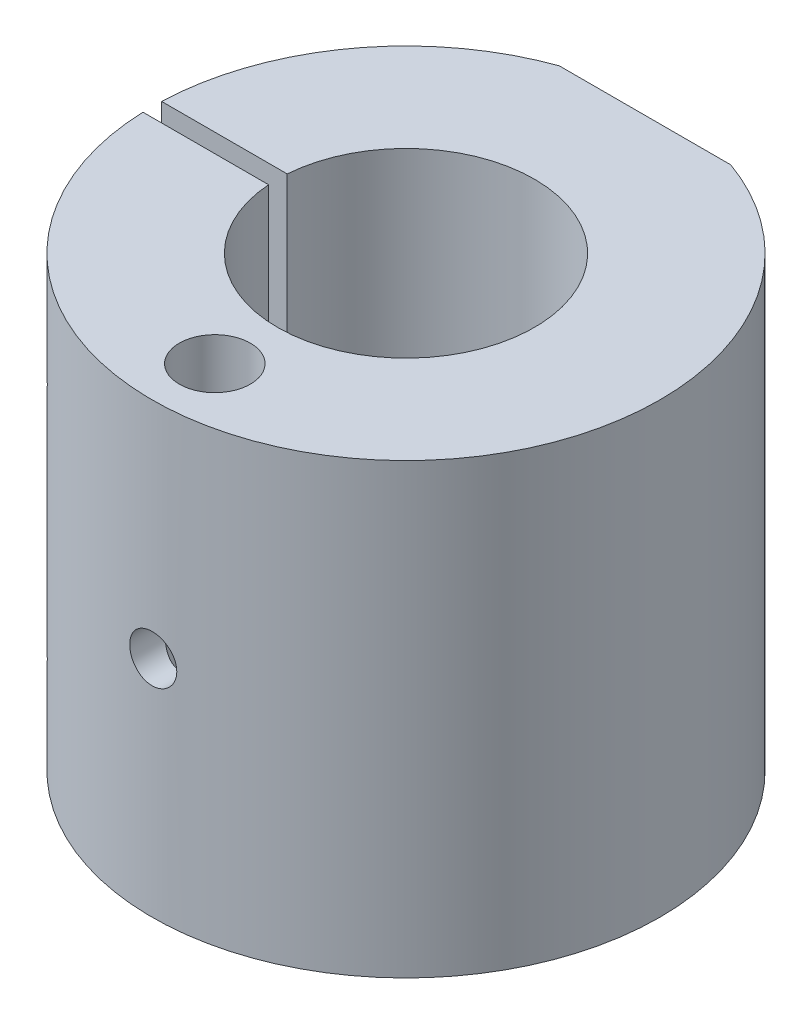
ISO-10303-21;
HEADER;
FILE_DESCRIPTION(('STEP AP214'),'2;1');
FILE_NAME('part.step','',(''),(''),'','','');
FILE_SCHEMA(('AUTOMOTIVE_DESIGN { 1 0 10303 214 1 1 1 1 }'));
ENDSEC;
DATA;
#1=APPLICATION_CONTEXT('core data for automotive mechanical design processes');
#2=APPLICATION_PROTOCOL_DEFINITION('international standard','automotive_design',2000,#1);
#3=PRODUCT_CONTEXT('',#1,'mechanical');
#4=PRODUCT('Part','Part','',(#3));
#5=PRODUCT_RELATED_PRODUCT_CATEGORY('part','',(#4));
#6=PRODUCT_DEFINITION_FORMATION('','',#4);
#7=PRODUCT_DEFINITION_CONTEXT('part definition',#1,'design');
#8=PRODUCT_DEFINITION('design','',#6,#7);
#9=PRODUCT_DEFINITION_SHAPE('','',#8);
#10=(LENGTH_UNIT() NAMED_UNIT(*) SI_UNIT(.MILLI.,.METRE.));
#11=(NAMED_UNIT(*) PLANE_ANGLE_UNIT() SI_UNIT($,.RADIAN.));
#12=(NAMED_UNIT(*) SI_UNIT($,.STERADIAN.) SOLID_ANGLE_UNIT());
#13=UNCERTAINTY_MEASURE_WITH_UNIT(LENGTH_MEASURE(1.E-05),#10,'distance_accuracy_value','');
#14=(GEOMETRIC_REPRESENTATION_CONTEXT(3) GLOBAL_UNCERTAINTY_ASSIGNED_CONTEXT((#13)) GLOBAL_UNIT_ASSIGNED_CONTEXT((#10,
#11,#12)) REPRESENTATION_CONTEXT('',''));
#15=CARTESIAN_POINT('',(0.,0.,0.));
#16=DIRECTION('',(0.,0.,1.));
#17=DIRECTION('',(1.,0.,0.));
#18=AXIS2_PLACEMENT_3D('',#15,#16,#17);
#19=CARTESIAN_POINT('',(0.,38.1,0.));
#20=DIRECTION('',(0.,-1.,0.));
#21=DIRECTION('',(0.,0.,-1.));
#22=AXIS2_PLACEMENT_3D('',#19,#20,#21);
#23=CYLINDRICAL_SURFACE('',#22,21.59);
#24=CARTESIAN_POINT('',(0.,38.1,0.));
#25=DIRECTION('',(0.,1.,0.));
#26=DIRECTION('',(0.,0.,1.));
#27=AXIS2_PLACEMENT_3D('',#24,#25,#26);
#28=CIRCLE('',#27,21.59);
#29=CARTESIAN_POINT('',(-7.29559456110329,38.1,-20.32));
#30=VERTEX_POINT('',#29);
#31=CARTESIAN_POINT('',(-21.5754040735626,38.1,-0.793749999999997));
#32=VERTEX_POINT('',#31);
#33=EDGE_CURVE('E56',#30,#32,#28,.T.);
#34=ORIENTED_EDGE('',*,*,#33,.F.);
#35=DIRECTION('',(0.,1.,0.));
#36=VECTOR('',#35,1.);
#37=CARTESIAN_POINT('',(-7.29559456110329,-0.001000000000001,-20.32));
#38=LINE('',#37,#36);
#39=CARTESIAN_POINT('',(-7.29559456110329,0.,-20.32));
#40=VERTEX_POINT('',#39);
#41=EDGE_CURVE('E115',#40,#30,#38,.T.);
#42=ORIENTED_EDGE('',*,*,#41,.F.);
#43=CARTESIAN_POINT('',(0.,0.,0.));
#44=DIRECTION('',(0.,1.,0.));
#45=DIRECTION('',(0.,0.,1.));
#46=AXIS2_PLACEMENT_3D('',#43,#44,#45);
#47=CIRCLE('',#46,21.59);
#48=CARTESIAN_POINT('',(-21.5754040735626,0.,-0.793749999999997));
#49=VERTEX_POINT('',#48);
#50=EDGE_CURVE('E154',#40,#49,#47,.T.);
#51=ORIENTED_EDGE('',*,*,#50,.T.);
#52=DIRECTION('',(0.,-1.,0.));
#53=VECTOR('',#52,1.);
#54=CARTESIAN_POINT('',(-21.5754040735626,38.1,-0.793749999999997));
#55=LINE('',#54,#53);
#56=EDGE_CURVE('E138',#32,#49,#55,.T.);
#57=ORIENTED_EDGE('',*,*,#56,.F.);
#58=EDGE_LOOP('',(#34,#42,#51,#57));
#59=FACE_BOUND('',#58,.T.);
#60=ADVANCED_FACE('F47',(#59),#23,.T.);
#61=CARTESIAN_POINT('',(0.,38.1,0.));
#62=DIRECTION('',(0.,1.,0.));
#63=DIRECTION('',(0.,0.,1.));
#64=AXIS2_PLACEMENT_3D('',#61,#62,#63);
#65=PLANE('',#64);
#66=DIRECTION('',(1.,0.,0.));
#67=VECTOR('',#66,1.);
#68=CARTESIAN_POINT('',(7.29559456110329,38.1,-20.32));
#69=LINE('',#68,#67);
#70=CARTESIAN_POINT('',(7.29559456110329,38.1,-20.32));
#71=VERTEX_POINT('',#70);
#72=EDGE_CURVE('E63',#30,#71,#69,.T.);
#73=ORIENTED_EDGE('',*,*,#72,.F.);
#74=ORIENTED_EDGE('',*,*,#33,.T.);
#75=DIRECTION('',(-1.,0.,0.));
#76=VECTOR('',#75,1.);
#77=CARTESIAN_POINT('',(0.,38.1,-0.79375));
#78=LINE('',#77,#76);
#79=CARTESIAN_POINT('',(-10.8931191555725,38.1,-0.793749999999999));
#80=VERTEX_POINT('',#79);
#81=EDGE_CURVE('E144',#80,#32,#78,.T.);
#82=ORIENTED_EDGE('',*,*,#81,.F.);
#83=CARTESIAN_POINT('',(0.,38.1,0.));
#84=DIRECTION('',(0.,1.,0.));
#85=DIRECTION('',(0.,0.,1.));
#86=AXIS2_PLACEMENT_3D('',#83,#84,#85);
#87=CIRCLE('',#86,10.922);
#88=CARTESIAN_POINT('',(-10.8931191555725,38.1,0.793750000000001));
#89=VERTEX_POINT('',#88);
#90=EDGE_CURVE('E151',#89,#80,#87,.T.);
#91=ORIENTED_EDGE('',*,*,#90,.F.);
#92=DIRECTION('',(1.,0.,0.));
#93=VECTOR('',#92,1.);
#94=CARTESIAN_POINT('',(0.,38.1,0.79375));
#95=LINE('',#94,#93);
#96=CARTESIAN_POINT('',(-21.5754040735626,38.1,0.793750000000003));
#97=VERTEX_POINT('',#96);
#98=EDGE_CURVE('E147',#97,#89,#95,.T.);
#99=ORIENTED_EDGE('',*,*,#98,.F.);
#100=EDGE_CURVE('E13',#97,#71,#28,.T.);
#101=ORIENTED_EDGE('',*,*,#100,.T.);
#102=EDGE_LOOP('',(#73,#74,#82,#91,#99,#101));
#103=FACE_BOUND('',#102,.T.);
#104=CARTESIAN_POINT('',(0.,38.1,16.256));
#105=DIRECTION('',(0.,1.,0.));
#106=DIRECTION('',(0.,0.,1.));
#107=AXIS2_PLACEMENT_3D('',#104,#105,#106);
#108=CIRCLE('',#107,3.0226);
#109=CARTESIAN_POINT('',(0.,38.1,19.2786));
#110=VERTEX_POINT('',#109);
#111=EDGE_CURVE('E127',#110,#110,#108,.T.);
#112=ORIENTED_EDGE('',*,*,#111,.F.);
#113=EDGE_LOOP('',(#112));
#114=FACE_BOUND('',#113,.T.);
#115=ADVANCED_FACE('F169',(#103,#114),#65,.T.);
#116=CARTESIAN_POINT('',(0.,0.,0.));
#117=DIRECTION('',(0.,1.,0.));
#118=DIRECTION('',(0.,0.,1.));
#119=AXIS2_PLACEMENT_3D('',#116,#117,#118);
#120=PLANE('',#119);
#121=CARTESIAN_POINT('',(0.,0.,16.256));
#122=DIRECTION('',(0.,1.,0.));
#123=DIRECTION('',(0.,0.,1.));
#124=AXIS2_PLACEMENT_3D('',#121,#122,#123);
#125=CIRCLE('',#124,3.0226);
#126=CARTESIAN_POINT('',(0.,0.,19.2786));
#127=VERTEX_POINT('',#126);
#128=EDGE_CURVE('E130',#127,#127,#125,.F.);
#129=ORIENTED_EDGE('',*,*,#128,.F.);
#130=EDGE_LOOP('',(#129));
#131=FACE_BOUND('',#130,.T.);
#132=ORIENTED_EDGE('',*,*,#50,.F.);
#133=DIRECTION('',(-1.,0.,0.));
#134=VECTOR('',#133,1.);
#135=CARTESIAN_POINT('',(7.29559456110329,0.,-20.32));
#136=LINE('',#135,#134);
#137=CARTESIAN_POINT('',(7.29559456110329,0.,-20.32));
#138=VERTEX_POINT('',#137);
#139=EDGE_CURVE('E124',#138,#40,#136,.T.);
#140=ORIENTED_EDGE('',*,*,#139,.F.);
#141=CARTESIAN_POINT('',(-21.5754040735626,0.,0.793750000000003));
#142=VERTEX_POINT('',#141);
#143=EDGE_CURVE('E51',#142,#138,#47,.T.);
#144=ORIENTED_EDGE('',*,*,#143,.F.);
#145=DIRECTION('',(-1.,0.,0.));
#146=VECTOR('',#145,1.);
#147=CARTESIAN_POINT('',(0.,0.,0.79375));
#148=LINE('',#147,#146);
#149=CARTESIAN_POINT('',(-10.8931191555725,0.,0.793750000000001));
#150=VERTEX_POINT('',#149);
#151=EDGE_CURVE('E142',#150,#142,#148,.T.);
#152=ORIENTED_EDGE('',*,*,#151,.F.);
#153=CARTESIAN_POINT('',(0.,0.,0.));
#154=DIRECTION('',(0.,1.,0.));
#155=DIRECTION('',(0.,0.,1.));
#156=AXIS2_PLACEMENT_3D('',#153,#154,#155);
#157=CIRCLE('',#156,10.922);
#158=CARTESIAN_POINT('',(-10.8931191555725,0.,-0.793749999999999));
#159=VERTEX_POINT('',#158);
#160=EDGE_CURVE('E150',#150,#159,#157,.T.);
#161=ORIENTED_EDGE('',*,*,#160,.T.);
#162=DIRECTION('',(1.,0.,0.));
#163=VECTOR('',#162,1.);
#164=CARTESIAN_POINT('',(0.,0.,-0.79375));
#165=LINE('',#164,#163);
#166=EDGE_CURVE('E71',#49,#159,#165,.T.);
#167=ORIENTED_EDGE('',*,*,#166,.F.);
#168=EDGE_LOOP('',(#132,#140,#144,#152,#161,#167));
#169=FACE_BOUND('',#168,.T.);
#170=ADVANCED_FACE('F160',(#131,#169),#120,.F.);
#171=CARTESIAN_POINT('',(-17.8842616145675,29.1092355947267,12.0946800909204));
#172=CARTESIAN_POINT('',(-17.8842585584311,29.1645112923969,12.0946849197344));
#173=CARTESIAN_POINT('',(-17.8814572272963,29.2198141170862,12.0988300645471));
#174=CARTESIAN_POINT('',(-17.8705178537524,29.3287236810063,12.114981650848));
#175=CARTESIAN_POINT('',(-17.8623733870349,29.3823282969634,12.1269975557019));
#176=CARTESIAN_POINT('',(-17.8390428583441,29.4983717990455,12.1612978423738));
#177=CARTESIAN_POINT('',(-17.8226798560821,29.5600623082845,12.1852913730921));
#178=CARTESIAN_POINT('',(-17.7844092639658,29.6779206339718,12.2410797122205));
#179=CARTESIAN_POINT('',(-17.7624916573325,29.7340782159082,12.272888611114));
#180=CARTESIAN_POINT('',(-17.7021786253477,29.8678650941383,12.3598131360766));
#181=CARTESIAN_POINT('',(-17.6610722740068,29.941887306217,12.4185541520384));
#182=CARTESIAN_POINT('',(-17.5722168533333,30.0782690994564,12.5439725121161));
#183=CARTESIAN_POINT('',(-17.5244513932063,30.140598984916,12.6106693784964));
#184=CARTESIAN_POINT('',(-17.4330611129427,30.2446953739167,12.7366173584903));
#185=CARTESIAN_POINT('',(-17.390220675252,30.2881462643902,12.7950704346375));
#186=CARTESIAN_POINT('',(-17.3018580064292,30.3687262773738,12.9143067796996));
#187=CARTESIAN_POINT('',(-17.2563341085997,30.4058514140689,12.9750914884301));
#188=CARTESIAN_POINT('',(-17.1630301734843,30.4742394300064,13.0982620054874));
#189=CARTESIAN_POINT('',(-17.1152487084977,30.5054985356958,13.1606488152965));
#190=CARTESIAN_POINT('',(-17.0177614025057,30.5624433797972,13.2864686226405));
#191=CARTESIAN_POINT('',(-16.9680547882346,30.5881268507293,13.3499020345623));
#192=CARTESIAN_POINT('',(-16.8107302256385,30.6597102193637,13.548316600322));
#193=CARTESIAN_POINT('',(-16.7001759514523,30.696334382109,13.6844250475389));
#194=CARTESIAN_POINT('',(-16.4736455196231,30.7458853081251,13.9563052067048));
#195=CARTESIAN_POINT('',(-16.3576704918395,30.7588169872829,14.0920769826691));
#196=CARTESIAN_POINT('',(-16.1227397021436,30.7596328204156,14.3602577938445));
#197=CARTESIAN_POINT('',(-16.0037976672796,30.7476166288553,14.4926780776448));
#198=CARTESIAN_POINT('',(-15.7653949829693,30.6959029004973,14.7516512659179));
#199=CARTESIAN_POINT('',(-15.6459351458561,30.656239241519,14.8782111492432));
#200=CARTESIAN_POINT('',(-15.44712543031,30.5621778983121,15.084040837782));
#201=CARTESIAN_POINT('',(-15.3666530646227,30.5159617818699,15.1659624368816));
#202=CARTESIAN_POINT('',(-15.2103500011545,30.4066084309901,15.3227122435066));
#203=CARTESIAN_POINT('',(-15.1345126755737,30.343496086993,15.3975506677569));
#204=CARTESIAN_POINT('',(-15.0081440129358,30.2161118135675,15.5206183746334));
#205=CARTESIAN_POINT('',(-14.9558643058362,30.1556286737283,15.5709592075219));
#206=CARTESIAN_POINT('',(-14.8585029439286,30.0238259659124,15.6638916091562));
#207=CARTESIAN_POINT('',(-14.8134122016301,29.9525203048657,15.7064929709427));
#208=CARTESIAN_POINT('',(-14.7406620301069,29.8139313265651,15.7747584769749));
#209=CARTESIAN_POINT('',(-14.7113204368668,29.7483633283255,15.8020989405364));
#210=CARTESIAN_POINT('',(-14.6608659703766,29.6114659544436,15.8489210375911));
#211=CARTESIAN_POINT('',(-14.6397487678209,29.5401396339109,15.8684068059724));
#212=CARTESIAN_POINT('',(-14.6070932631717,29.3930135812178,15.8984726656273));
#213=CARTESIAN_POINT('',(-14.5956123924403,29.3171898720288,15.9089993670831));
#214=CARTESIAN_POINT('',(-14.5833823428621,29.1639641962526,15.9202115284396));
#215=CARTESIAN_POINT('',(-14.5826288389539,29.0865628783317,15.9209009545349));
#216=CARTESIAN_POINT('',(-14.5914323644677,28.9406586228388,15.9128320278873));
#217=CARTESIAN_POINT('',(-14.599969761122,28.8720373546274,15.905007998292));
#218=CARTESIAN_POINT('',(-14.6251935422651,28.7376511212979,15.8818167866163));
#219=CARTESIAN_POINT('',(-14.6418801298901,28.6718862274257,15.8664494165019));
#220=CARTESIAN_POINT('',(-14.6829037339814,28.5431381235274,15.8284942082047));
#221=CARTESIAN_POINT('',(-14.7074156746269,28.4802603582335,15.8057410545568));
#222=CARTESIAN_POINT('',(-14.762676512127,28.3600195190934,15.7541395933262));
#223=CARTESIAN_POINT('',(-14.7934286040355,28.3026592925792,15.7252881630152));
#224=CARTESIAN_POINT('',(-14.8748081860302,28.1696146279086,15.6484033976926));
#225=CARTESIAN_POINT('',(-14.9281716891288,28.097216542698,15.5975637779813));
#226=CARTESIAN_POINT('',(-15.0420090865757,27.9652664469093,15.4878132414272));
#227=CARTESIAN_POINT('',(-15.1024977071319,27.9057417891195,15.4288855651509));
#228=CARTESIAN_POINT('',(-15.2516104423623,27.7789162389359,15.2817243823099));
#229=CARTESIAN_POINT('',(-15.3422565097745,27.7171182456415,15.1908074738995));
#230=CARTESIAN_POINT('',(-15.5273981404125,27.6145520590779,15.0015230460747));
#231=CARTESIAN_POINT('',(-15.6218992187096,27.5738152222445,14.903144666074));
#232=CARTESIAN_POINT('',(-15.8473927615106,27.4993517899627,14.6637054599595));
#233=CARTESIAN_POINT('',(-15.9788214439848,27.473937595291,14.5204359628176));
#234=CARTESIAN_POINT('',(-16.173602389331,27.4590640519481,14.3021803774759));
#235=CARTESIAN_POINT('',(-16.2382193297395,27.4579948276925,14.2287709400857));
#236=CARTESIAN_POINT('',(-16.3663180723804,27.463280561377,14.0812368456421));
#237=CARTESIAN_POINT('',(-16.4298003088919,27.4696326144428,14.0071124796897));
#238=CARTESIAN_POINT('',(-16.5566742161214,27.4897392317191,13.8569307243798));
#239=CARTESIAN_POINT('',(-16.6200323855149,27.5036555000825,13.7808670488909));
#240=CARTESIAN_POINT('',(-16.7448493511203,27.5388841052749,13.6289316863076));
#241=CARTESIAN_POINT('',(-16.8063087582584,27.5601940356278,13.5530599448266));
#242=CARTESIAN_POINT('',(-16.9269306239158,27.6102461409653,13.4021058087891));
#243=CARTESIAN_POINT('',(-16.9860959690377,27.6389786024766,13.3270225150763));
#244=CARTESIAN_POINT('',(-17.1017915387924,27.7041388111514,13.178228384632));
#245=CARTESIAN_POINT('',(-17.1583230595029,27.7405627235517,13.1045168838132));
#246=CARTESIAN_POINT('',(-17.2792735064005,27.8297127355676,12.9447569599658));
#247=CARTESIAN_POINT('',(-17.3430128361252,27.884241820427,12.8591847416955));
#248=CARTESIAN_POINT('',(-17.4646877403234,28.0065160425828,12.6934350982814));
#249=CARTESIAN_POINT('',(-17.5226292148152,28.0742475335283,12.6132522166944));
#250=CARTESIAN_POINT('',(-17.6154360323137,28.2040661962542,12.483150122214));
#251=CARTESIAN_POINT('',(-17.6522441974051,28.2625076184724,12.431005675959));
#252=CARTESIAN_POINT('',(-17.7201138987545,28.388244490511,12.3340641361412));
#253=CARTESIAN_POINT('',(-17.7511853404747,28.4555243287413,12.2892543933953));
#254=CARTESIAN_POINT('',(-17.7974218277339,28.5782160002861,12.2221533550142));
#255=CARTESIAN_POINT('',(-17.8145820634211,28.6313542701135,12.1971076601833));
#256=CARTESIAN_POINT('',(-17.8438317185316,28.7417777321301,12.1542768301767));
#257=CARTESIAN_POINT('',(-17.855931801176,28.7990539025784,12.1364764291857));
#258=CARTESIAN_POINT('',(-17.8713010471485,28.8987125838817,12.113827840313));
#259=CARTESIAN_POINT('',(-17.8761358244356,28.9403395398661,12.1066882968306));
#260=CARTESIAN_POINT('',(-17.8826172206868,29.0243842200103,12.097112657936));
#261=CARTESIAN_POINT('',(-17.884263960682,29.0668019140886,12.0946763839686));
#262=CARTESIAN_POINT('',(-17.8842616145675,29.1092355947267,12.0946800909204));
#263=B_SPLINE_CURVE_WITH_KNOTS('',3,(#171,#172,#173,#174,#175,#176,#177,#178,#179,#180,#181,
#182,#183,#184,#185,#186,#187,#188,#189,#190,#191,#192,#193,#194,#195,#196,#197,#198,#199,#200,
#201,#202,#203,#204,#205,#206,#207,#208,#209,#210,#211,#212,#213,#214,#215,#216,#217,#218,#219,
#220,#221,#222,#223,#224,#225,#226,#227,#228,#229,#230,#231,#232,#233,#234,#235,#236,#237,#238,
#239,#240,#241,#242,#243,#244,#245,#246,#247,#248,#249,#250,#251,#252,#253,#254,#255,#256,#257,
#258,#259,#260,#261,#262),.UNSPECIFIED.,.T.,.F.,(4,2,2,2,2,2,2,2,2,2,2,2,2,2,2,2,2,2,2,2,2,2,2,
2,2,2,2,2,2,2,2,2,2,2,2,2,2,2,2,2,2,2,2,2,2,4),(0.,0.165659078587435,0.331517702981557,
0.534935807254163,0.738723384473475,1.04616357672133,1.35437432358516,1.60753195243394,
1.86084850902818,2.11432746690892,2.36790931642835,2.90345810024024,3.43889575194419,
3.97219870933683,4.50484933018719,4.87506917664172,5.24474661167796,5.5271799054836,
5.80925329828255,6.03890387535631,6.26843340083052,6.49932137187992,6.73011625084476,
6.93791990459857,7.14572873857067,7.35855306871122,7.57148664440744,7.87970602018601,
8.18857398689369,8.6136715059996,9.03940011264916,9.62426561065011,9.9174726319828,
10.2105649231623,10.510184402259,10.8097064530741,11.108838503529,11.4078217649414,
11.7665166478851,12.1248427218824,12.3837748211045,12.6422555595924,12.8252366201451,
13.0078301190627,13.1350070090302,13.2621790707475),.UNSPECIFIED.);
#264=CARTESIAN_POINT('',(-17.8842616145675,29.1092355947267,12.0946800909204));
#265=VERTEX_POINT('',#264);
#266=EDGE_CURVE('E211',#265,#265,#263,.T.);
#267=ORIENTED_EDGE('',*,*,#266,.T.);
#268=EDGE_LOOP('',(#267));
#269=FACE_BOUND('',#268,.T.);
#270=CARTESIAN_POINT('',(-17.8842616145675,8.90395449077097,12.0946800909204));
#271=CARTESIAN_POINT('',(-17.8842585584311,8.95923018844116,12.0946849197344));
#272=CARTESIAN_POINT('',(-17.8814572272963,9.01453301313049,12.0988300645471));
#273=CARTESIAN_POINT('',(-17.8705178537524,9.12344257705059,12.114981650848));
#274=CARTESIAN_POINT('',(-17.8623733870349,9.17704719300767,12.1269975557019));
#275=CARTESIAN_POINT('',(-17.8390428583441,9.29309069508979,12.1612978423738));
#276=CARTESIAN_POINT('',(-17.8226798560821,9.35478120432878,12.1852913730921));
#277=CARTESIAN_POINT('',(-17.7844092639658,9.472639530016,12.2410797122205));
#278=CARTESIAN_POINT('',(-17.7624916573325,9.52879711195247,12.272888611114));
#279=CARTESIAN_POINT('',(-17.7021786253477,9.66258399018259,12.3598131360766));
#280=CARTESIAN_POINT('',(-17.6610722740068,9.73660620226129,12.4185541520384));
#281=CARTESIAN_POINT('',(-17.5722168533332,9.87298799550064,12.5439725121161));
#282=CARTESIAN_POINT('',(-17.5244513932063,9.93531788096027,12.6106693784964));
#283=CARTESIAN_POINT('',(-17.4330611129427,10.039414269961,12.7366173584903));
#284=CARTESIAN_POINT('',(-17.390220675252,10.0828651604344,12.7950704346375));
#285=CARTESIAN_POINT('',(-17.3018580064292,10.1634451734181,12.9143067796996));
#286=CARTESIAN_POINT('',(-17.2563341085997,10.2005703101132,12.9750914884301));
#287=CARTESIAN_POINT('',(-17.1630301734843,10.2689583260507,13.0982620054874));
#288=CARTESIAN_POINT('',(-17.1152487084977,10.3002174317401,13.1606488152965));
#289=CARTESIAN_POINT('',(-17.0177614025057,10.3571622758414,13.2864686226405));
#290=CARTESIAN_POINT('',(-16.9680547882346,10.3828457467735,13.3499020345623));
#291=CARTESIAN_POINT('',(-16.8107302256385,10.4544291154079,13.548316600322));
#292=CARTESIAN_POINT('',(-16.7001759514523,10.4910532781533,13.6844250475389));
#293=CARTESIAN_POINT('',(-16.4736455196231,10.5406042041693,13.9563052067048));
#294=CARTESIAN_POINT('',(-16.3576704918395,10.5535358833271,14.0920769826691));
#295=CARTESIAN_POINT('',(-16.1227397021436,10.5543517164599,14.3602577938445));
#296=CARTESIAN_POINT('',(-16.0037976672796,10.5423355248995,14.4926780776448));
#297=CARTESIAN_POINT('',(-15.7653949829692,10.4906217965416,14.7516512659179));
#298=CARTESIAN_POINT('',(-15.6459351458561,10.4509581375632,14.8782111492432));
#299=CARTESIAN_POINT('',(-15.44712543031,10.3568967943563,15.084040837782));
#300=CARTESIAN_POINT('',(-15.3666530646227,10.3106806779142,15.1659624368816));
#301=CARTESIAN_POINT('',(-15.2103500011545,10.2013273270343,15.3227122435066));
#302=CARTESIAN_POINT('',(-15.1345126755737,10.1382149830372,15.3975506677569));
#303=CARTESIAN_POINT('',(-15.0081440129358,10.0108307096118,15.5206183746334));
#304=CARTESIAN_POINT('',(-14.9558643058362,9.95034756977252,15.5709592075219));
#305=CARTESIAN_POINT('',(-14.8585029439286,9.81854486195667,15.6638916091562));
#306=CARTESIAN_POINT('',(-14.8134122016301,9.74723920090991,15.7064929709427));
#307=CARTESIAN_POINT('',(-14.7406620301069,9.60865022260932,15.7747584769749));
#308=CARTESIAN_POINT('',(-14.7113204368668,9.54308222436972,15.8020989405364));
#309=CARTESIAN_POINT('',(-14.6608659703766,9.40618485048783,15.8489210375911));
#310=CARTESIAN_POINT('',(-14.6397487678209,9.33485852995519,15.8684068059724));
#311=CARTESIAN_POINT('',(-14.6070932631717,9.18773247726206,15.8984726656274));
#312=CARTESIAN_POINT('',(-14.5956123924403,9.11190876807305,15.9089993670831));
#313=CARTESIAN_POINT('',(-14.5833823428621,8.95868309229688,15.9202115284396));
#314=CARTESIAN_POINT('',(-14.5826288389539,8.88128177437597,15.9209009545349));
#315=CARTESIAN_POINT('',(-14.5914323644677,8.73537751888308,15.9128320278873));
#316=CARTESIAN_POINT('',(-14.599969761122,8.66675625067163,15.905007998292));
#317=CARTESIAN_POINT('',(-14.6251935422651,8.53237001734219,15.8818167866163));
#318=CARTESIAN_POINT('',(-14.6418801298901,8.46660512347,15.8664494165019));
#319=CARTESIAN_POINT('',(-14.6829037339813,8.33785701957164,15.8284942082047));
#320=CARTESIAN_POINT('',(-14.7074156746269,8.27497925427777,15.8057410545568));
#321=CARTESIAN_POINT('',(-14.762676512127,8.15473841513762,15.7541395933262));
#322=CARTESIAN_POINT('',(-14.7934286040355,8.09737818862341,15.7252881630152));
#323=CARTESIAN_POINT('',(-14.8748081860302,7.96433352395281,15.6484033976926));
#324=CARTESIAN_POINT('',(-14.9281716891288,7.8919354387422,15.5975637779813));
#325=CARTESIAN_POINT('',(-15.0420090865757,7.75998534295359,15.4878132414272));
#326=CARTESIAN_POINT('',(-15.1024977071319,7.70046068516377,15.4288855651509));
#327=CARTESIAN_POINT('',(-15.2516104423623,7.57363513498014,15.2817243823099));
#328=CARTESIAN_POINT('',(-15.3422565097745,7.51183714168572,15.1908074738995));
#329=CARTESIAN_POINT('',(-15.5273981404125,7.40927095512215,15.0015230460747));
#330=CARTESIAN_POINT('',(-15.6218992187096,7.36853411828873,14.903144666074));
#331=CARTESIAN_POINT('',(-15.8473927615106,7.29407068600697,14.6637054599595));
#332=CARTESIAN_POINT('',(-15.9788214439848,7.26865649133528,14.5204359628176));
#333=CARTESIAN_POINT('',(-16.173602389331,7.25378294799231,14.3021803774759));
#334=CARTESIAN_POINT('',(-16.2382193297395,7.25271372373671,14.2287709400857));
#335=CARTESIAN_POINT('',(-16.3663180723804,7.25799945742126,14.0812368456421));
#336=CARTESIAN_POINT('',(-16.4298003088919,7.26435151048706,14.0071124796897));
#337=CARTESIAN_POINT('',(-16.5566742161214,7.2844581277634,13.8569307243798));
#338=CARTESIAN_POINT('',(-16.6200323855149,7.2983743961268,13.7808670488909));
#339=CARTESIAN_POINT('',(-16.7448493511203,7.33360300131918,13.6289316863076));
#340=CARTESIAN_POINT('',(-16.8063087582584,7.35491293167203,13.5530599448266));
#341=CARTESIAN_POINT('',(-16.9269306239159,7.40496503700958,13.4021058087891));
#342=CARTESIAN_POINT('',(-16.9860959690377,7.43369749852087,13.3270225150763));
#343=CARTESIAN_POINT('',(-17.1017915387924,7.49885770719569,13.178228384632));
#344=CARTESIAN_POINT('',(-17.1583230595029,7.53528161959592,13.1045168838132));
#345=CARTESIAN_POINT('',(-17.2792735064005,7.62443163161182,12.9447569599658));
#346=CARTESIAN_POINT('',(-17.3430128361253,7.67896071647124,12.8591847416954));
#347=CARTESIAN_POINT('',(-17.4646877403234,7.80123493862706,12.6934350982814));
#348=CARTESIAN_POINT('',(-17.5226292148152,7.86896642957252,12.6132522166944));
#349=CARTESIAN_POINT('',(-17.6154360323137,7.99878509229849,12.483150122214));
#350=CARTESIAN_POINT('',(-17.6522441974051,8.05722651451665,12.431005675959));
#351=CARTESIAN_POINT('',(-17.7201138987545,8.18296338655531,12.3340641361412));
#352=CARTESIAN_POINT('',(-17.7511853404747,8.25024322478559,12.2892543933953));
#353=CARTESIAN_POINT('',(-17.7974218277339,8.37293489633033,12.2221533550142));
#354=CARTESIAN_POINT('',(-17.8145820634211,8.42607316615779,12.1971076601833));
#355=CARTESIAN_POINT('',(-17.8438317185316,8.5364966281744,12.1542768301767));
#356=CARTESIAN_POINT('',(-17.855931801176,8.59377279862261,12.1364764291857));
#357=CARTESIAN_POINT('',(-17.8713010471485,8.69343147992598,12.113827840313));
#358=CARTESIAN_POINT('',(-17.8761358244355,8.73505843591039,12.1066882968306));
#359=CARTESIAN_POINT('',(-17.8826172206868,8.81910311605453,12.097112657936));
#360=CARTESIAN_POINT('',(-17.884263960682,8.86152081013288,12.0946763839686));
#361=CARTESIAN_POINT('',(-17.8842616145675,8.90395449077097,12.0946800909204));
#362=B_SPLINE_CURVE_WITH_KNOTS('',3,(#270,#271,#272,#273,#274,#275,#276,#277,#278,#279,#280,
#281,#282,#283,#284,#285,#286,#287,#288,#289,#290,#291,#292,#293,#294,#295,#296,#297,#298,#299,
#300,#301,#302,#303,#304,#305,#306,#307,#308,#309,#310,#311,#312,#313,#314,#315,#316,#317,#318,
#319,#320,#321,#322,#323,#324,#325,#326,#327,#328,#329,#330,#331,#332,#333,#334,#335,#336,#337,
#338,#339,#340,#341,#342,#343,#344,#345,#346,#347,#348,#349,#350,#351,#352,#353,#354,#355,#356,
#357,#358,#359,#360,#361),.UNSPECIFIED.,.T.,.F.,(4,2,2,2,2,2,2,2,2,2,2,2,2,2,2,2,2,2,2,2,2,2,2,
2,2,2,2,2,2,2,2,2,2,2,2,2,2,2,2,2,2,2,2,2,2,4),(0.,0.165659078587435,0.331517702981557,
0.534935807254161,0.738723384473473,1.04616357672132,1.35437432358516,1.60753195243394,
1.86084850902818,2.11432746690892,2.36790931642835,2.90345810024023,3.43889575194419,
3.97219870933683,4.50484933018719,4.87506917664172,5.24474661167796,5.5271799054836,
5.80925329828255,6.03890387535631,6.26843340083052,6.49932137187993,6.73011625084477,
6.93791990459857,7.14572873857067,7.35855306871122,7.57148664440744,7.87970602018602,
8.1885739868937,8.61367150599961,9.03940011264917,9.62426561065012,9.9174726319828,
10.2105649231624,10.510184402259,10.8097064530741,11.108838503529,11.4078217649415,
11.7665166478851,12.1248427218824,12.3837748211045,12.6422555595924,12.8252366201451,
13.0078301190627,13.1350070090302,13.2621790707475),.UNSPECIFIED.);
#363=CARTESIAN_POINT('',(-17.8842616145675,8.90395449077097,12.0946800909204));
#364=VERTEX_POINT('',#363);
#365=EDGE_CURVE('E215',#364,#364,#362,.T.);
#366=ORIENTED_EDGE('',*,*,#365,.T.);
#367=EDGE_LOOP('',(#366));
#368=FACE_BOUND('',#367,.T.);
#369=CARTESIAN_POINT('',(2.00729802721872,19.05,21.4964847040144));
#370=CARTESIAN_POINT('',(2.00729315200402,19.1620797298763,21.4964859286819));
#371=CARTESIAN_POINT('',(1.99784490837548,19.2742345882647,21.497373908639));
#372=CARTESIAN_POINT('',(1.9602951285262,19.4954376582937,21.500829862449));
#373=CARTESIAN_POINT('',(1.93217276644652,19.6044822595296,21.50339971192));
#374=CARTESIAN_POINT('',(1.85809824177844,19.8162291816943,21.5099266613514));
#375=CARTESIAN_POINT('',(1.81215657919187,19.9189351963935,21.5138829442253));
#376=CARTESIAN_POINT('',(1.70376715146312,20.1151549335997,21.5227372800404));
#377=CARTESIAN_POINT('',(1.64132277883898,20.2086705399957,21.5276351393623));
#378=CARTESIAN_POINT('',(1.50148811129739,20.3841736708545,21.5378398918769));
#379=CARTESIAN_POINT('',(1.42405635280225,20.4661280971859,21.5431478946987));
#380=CARTESIAN_POINT('',(1.25653324830011,20.6158978501693,21.5535670543553));
#381=CARTESIAN_POINT('',(1.16644133358538,20.6837125413093,21.5586782023341));
#382=CARTESIAN_POINT('',(0.975953172027489,20.8033915713894,21.5681411304393));
#383=CARTESIAN_POINT('',(0.87553845726514,20.8552266358372,21.5724915106147));
#384=CARTESIAN_POINT('',(0.667383517909956,20.9412880080913,21.5799335867254));
#385=CARTESIAN_POINT('',(0.559643448124167,20.9755146878854,21.5830253092503));
#386=CARTESIAN_POINT('',(0.340225839817792,21.0252919216842,21.5875970559772));
#387=CARTESIAN_POINT('',(0.228560562014063,21.0408960891662,21.5890817057251));
#388=CARTESIAN_POINT('',(0.00418665265112915,21.0531508609169,21.5902910170721));
#389=CARTESIAN_POINT('',(-0.10852195521375,21.0498018945674,21.5900157185426));
#390=CARTESIAN_POINT('',(-0.331416129911213,21.0242891931587,21.5877430766123));
#391=CARTESIAN_POINT('',(-0.441608415788962,21.0021836174139,21.5857510560164));
#392=CARTESIAN_POINT('',(-0.656712302525307,20.939875409442,21.5802783143275));
#393=CARTESIAN_POINT('',(-0.761623844119942,20.899672574166,21.5767975765313));
#394=CARTESIAN_POINT('',(-0.963367825954429,20.8022485863444,21.5687329428121));
#395=CARTESIAN_POINT('',(-1.06018801952414,20.7450022143027,21.5641474140502));
#396=CARTESIAN_POINT('',(-1.24286787472539,20.615134448799,21.5543907517341));
#397=CARTESIAN_POINT('',(-1.3287272616014,20.5425126700416,21.5492196035064));
#398=CARTESIAN_POINT('',(-1.48738547525204,20.3836312861334,21.5388519389982));
#399=CARTESIAN_POINT('',(-1.5601341449455,20.2973215865718,21.53365540028));
#400=CARTESIAN_POINT('',(-1.69011805113349,20.1136885304336,21.52384407047));
#401=CARTESIAN_POINT('',(-1.74735326839092,20.0163651601999,21.5192292800995));
#402=CARTESIAN_POINT('',(-1.84468574024257,19.8134283157403,21.5111048548467));
#403=CARTESIAN_POINT('',(-1.88477977917346,19.7078132904052,21.5075954273614));
#404=CARTESIAN_POINT('',(-1.94665174959409,19.4913108326348,21.5020840931869));
#405=CARTESIAN_POINT('',(-1.9684301550184,19.3804235367031,21.5000821474903));
#406=CARTESIAN_POINT('',(-1.99298896736439,19.156961334864,21.4978196445365));
#407=CARTESIAN_POINT('',(-1.99583903462986,19.0443941467096,21.4975527021726));
#408=CARTESIAN_POINT('',(-1.9826429953518,18.8203837072983,21.4987736613665));
#409=CARTESIAN_POINT('',(-1.96659710574449,18.708940443153,21.500261542778));
#410=CARTESIAN_POINT('',(-1.91612292001776,18.4905433544549,21.5048182179867));
#411=CARTESIAN_POINT('',(-1.88172743055461,18.3835818839991,21.5078841900236));
#412=CARTESIAN_POINT('',(-1.79556378920802,18.1769473225958,21.5152483005414));
#413=CARTESIAN_POINT('',(-1.74379529588704,18.077274374939,21.5195464632388));
#414=CARTESIAN_POINT('',(-1.62417946022352,17.8877275670325,21.5289046818778));
#415=CARTESIAN_POINT('',(-1.55628575334649,17.7978830750252,21.5339669191604));
#416=CARTESIAN_POINT('',(-1.40641335588223,17.6308409574607,21.5442736901848));
#417=CARTESIAN_POINT('',(-1.3244343686465,17.5536435983302,21.5495182277641));
#418=CARTESIAN_POINT('',(-1.14841721760483,17.4138484591748,21.5596154333698));
#419=CARTESIAN_POINT('',(-1.0543430078996,17.3512959625278,21.5644668563792));
#420=CARTESIAN_POINT('',(-0.856984616514105,17.2428775300295,21.5732107203832));
#421=CARTESIAN_POINT('',(-0.753700546334302,17.1970113921965,21.5771031729856));
#422=CARTESIAN_POINT('',(-0.541017477991845,17.1233460275896,21.5834819168244));
#423=CARTESIAN_POINT('',(-0.431628300172229,17.0955186453548,21.5859703986317));
#424=CARTESIAN_POINT('',(-0.209706361325738,17.0586283305396,21.5892665995926));
#425=CARTESIAN_POINT('',(-0.0971736750640557,17.0495649520606,21.590074358686));
#426=CARTESIAN_POINT('',(0.127392931824222,17.0504654095253,21.5899150688703));
#427=CARTESIAN_POINT('',(0.239427147884017,17.0603584386665,21.5889546251547));
#428=CARTESIAN_POINT('',(0.460234789622525,17.0987424780685,21.5853765587067));
#429=CARTESIAN_POINT('',(0.569008211236884,17.1272335115094,21.5827589339089));
#430=CARTESIAN_POINT('',(0.78021180877445,17.2019867875741,21.5761567769419));
#431=CARTESIAN_POINT('',(0.882642413040057,17.2482478286328,21.5721723371954));
#432=CARTESIAN_POINT('',(1.07829530403391,17.35722006277,21.5632785503921));
#433=CARTESIAN_POINT('',(1.17151768583514,17.4199310859816,21.5583692128861));
#434=CARTESIAN_POINT('',(1.34647376146511,17.5602913488123,21.54815139911));
#435=CARTESIAN_POINT('',(1.42816479627486,17.63799366237,21.5428415468259));
#436=CARTESIAN_POINT('',(1.57738200666688,17.8060293275255,21.5324308077882));
#437=CARTESIAN_POINT('',(1.64490476490794,17.8963657176845,21.5273299716868));
#438=CARTESIAN_POINT('',(1.76398257085126,18.0873198122141,21.5179007420867));
#439=CARTESIAN_POINT('',(1.81550189292178,18.1879598621998,21.5135740858387));
#440=CARTESIAN_POINT('',(1.90084305671697,18.3964362183422,21.506202532365));
#441=CARTESIAN_POINT('',(1.93468504370336,18.5042641743085,21.5031561768735));
#442=CARTESIAN_POINT('',(1.97518714679849,18.6855957590582,21.4994645665876));
#443=CARTESIAN_POINT('',(1.98721247734562,18.7579366170657,21.4983523205275));
#444=CARTESIAN_POINT('',(2.00326949695651,18.9035076186405,21.4968619902647));
#445=CARTESIAN_POINT('',(2.00730121396046,18.9767377590985,21.496483903496));
#446=CARTESIAN_POINT('',(2.00729802721872,19.05,21.4964847040144));
#447=B_SPLINE_CURVE_WITH_KNOTS('',3,(#369,#370,#371,#372,#373,#374,#375,#376,#377,#378,#379,
#380,#381,#382,#383,#384,#385,#386,#387,#388,#389,#390,#391,#392,#393,#394,#395,#396,#397,#398,
#399,#400,#401,#402,#403,#404,#405,#406,#407,#408,#409,#410,#411,#412,#413,#414,#415,#416,#417,
#418,#419,#420,#421,#422,#423,#424,#425,#426,#427,#428,#429,#430,#431,#432,#433,#434,#435,#436,
#437,#438,#439,#440,#441,#442,#443,#444,#445,#446),.UNSPECIFIED.,.T.,.F.,(4,2,2,2,2,2,2,2,2,2,2,
2,2,2,2,2,2,2,2,2,2,2,2,2,2,2,2,2,2,2,2,2,2,2,2,2,2,2,4),(0.,0.33597166505309,0.672318645069279,
1.00846773338167,1.34454777206719,1.6815712424218,2.01860985707283,2.35626230278796,
2.69390761509578,3.03057849669709,3.36724175107292,3.70286490004323,4.0384918147562,
4.37461784946006,4.71075230821135,5.0481465987137,5.38554130759231,5.72299928354611,
6.06044852718251,6.39665519374759,6.73285800050841,7.06846172570644,7.40407204702503,
7.74065928079022,8.07725360425029,8.41487535634498,8.7524930215296,9.08958244539121,
9.42666385873387,9.76248864483652,10.098313849504,10.4341163504742,10.7699153839912,
11.1069258228989,11.4440174544038,11.7818562799849,12.1193092565602,12.3389218762784,
12.5585337283802),.UNSPECIFIED.);
#448=CARTESIAN_POINT('',(2.00729802721872,19.05,21.4964847040144));
#449=VERTEX_POINT('',#448);
#450=EDGE_CURVE('E118',#449,#449,#447,.T.);
#451=ORIENTED_EDGE('',*,*,#450,.F.);
#452=EDGE_LOOP('',(#451));
#453=FACE_BOUND('',#452,.T.);
#454=ORIENTED_EDGE('',*,*,#143,.T.);
#455=DIRECTION('',(0.,1.,0.));
#456=VECTOR('',#455,1.);
#457=CARTESIAN_POINT('',(7.29559456110329,-0.001000000000001,-20.32));
#458=LINE('',#457,#456);
#459=EDGE_CURVE('E122',#138,#71,#458,.T.);
#460=ORIENTED_EDGE('',*,*,#459,.T.);
#461=ORIENTED_EDGE('',*,*,#100,.F.);
#462=DIRECTION('',(0.,-1.,0.));
#463=VECTOR('',#462,1.);
#464=CARTESIAN_POINT('',(-21.5754040735626,38.1,0.793750000000003));
#465=LINE('',#464,#463);
#466=EDGE_CURVE('E140',#142,#97,#465,.F.);
#467=ORIENTED_EDGE('',*,*,#466,.F.);
#468=EDGE_LOOP('',(#454,#460,#461,#467));
#469=FACE_BOUND('',#468,.T.);
#470=ADVANCED_FACE('F49',(#269,#368,#453,#469),#23,.T.);
#471=CARTESIAN_POINT('',(0.,38.1,0.));
#472=DIRECTION('',(0.,-1.,0.));
#473=DIRECTION('',(0.,0.,-1.));
#474=AXIS2_PLACEMENT_3D('',#471,#472,#473);
#475=CYLINDRICAL_SURFACE('',#474,10.922);
#476=DIRECTION('',(0.,-1.,0.));
#477=VECTOR('',#476,1.);
#478=CARTESIAN_POINT('',(-10.8931191555725,38.1,0.793750000000001));
#479=LINE('',#478,#477);
#480=EDGE_CURVE('E135',#150,#89,#479,.F.);
#481=ORIENTED_EDGE('',*,*,#480,.T.);
#482=ORIENTED_EDGE('',*,*,#90,.T.);
#483=DIRECTION('',(0.,-1.,0.));
#484=VECTOR('',#483,1.);
#485=CARTESIAN_POINT('',(-10.8931191555725,38.1,-0.793749999999999));
#486=LINE('',#485,#484);
#487=EDGE_CURVE('E133',#80,#159,#486,.T.);
#488=ORIENTED_EDGE('',*,*,#487,.T.);
#489=ORIENTED_EDGE('',*,*,#160,.F.);
#490=EDGE_LOOP('',(#481,#482,#488,#489));
#491=FACE_BOUND('',#490,.T.);
#492=ADVANCED_FACE('F163',(#491),#475,.F.);
#493=CARTESIAN_POINT('',(0.,-0.001000000000001,-0.79375));
#494=DIRECTION('',(0.,0.,-1.));
#495=DIRECTION('',(-1.,0.,0.));
#496=AXIS2_PLACEMENT_3D('',#493,#494,#495);
#497=PLANE('',#496);
#498=ORIENTED_EDGE('',*,*,#56,.T.);
#499=ORIENTED_EDGE('',*,*,#166,.T.);
#500=ORIENTED_EDGE('',*,*,#487,.F.);
#501=ORIENTED_EDGE('',*,*,#81,.T.);
#502=EDGE_LOOP('',(#498,#499,#500,#501));
#503=FACE_BOUND('',#502,.T.);
#504=ADVANCED_FACE('F166',(#503),#497,.F.);
#505=CARTESIAN_POINT('',(0.,-0.001000000000001,0.79375));
#506=DIRECTION('',(0.,0.,1.));
#507=DIRECTION('',(1.,0.,0.));
#508=AXIS2_PLACEMENT_3D('',#505,#506,#507);
#509=PLANE('',#508);
#510=CARTESIAN_POINT('',(-16.2342616145675,29.1092355947267,0.793750000000001));
#511=DIRECTION('',(0.,0.,-1.));
#512=DIRECTION('',(-1.,0.,0.));
#513=AXIS2_PLACEMENT_3D('',#510,#511,#512);
#514=CIRCLE('',#513,1.64999999999999);
#515=CARTESIAN_POINT('',(-17.8842616145675,29.1092355947267,0.793750000000001));
#516=VERTEX_POINT('',#515);
#517=EDGE_CURVE('E251',#516,#516,#514,.T.);
#518=ORIENTED_EDGE('',*,*,#517,.F.);
#519=EDGE_LOOP('',(#518));
#520=FACE_BOUND('',#519,.T.);
#521=CARTESIAN_POINT('',(-16.2342616145675,8.90395449077097,0.793750000000001));
#522=DIRECTION('',(0.,0.,-1.));
#523=DIRECTION('',(-1.,0.,0.));
#524=AXIS2_PLACEMENT_3D('',#521,#522,#523);
#525=CIRCLE('',#524,1.64999999999999);
#526=CARTESIAN_POINT('',(-17.8842616145675,8.90395449077097,0.793750000000001));
#527=VERTEX_POINT('',#526);
#528=EDGE_CURVE('E244',#527,#527,#525,.T.);
#529=ORIENTED_EDGE('',*,*,#528,.F.);
#530=EDGE_LOOP('',(#529));
#531=FACE_BOUND('',#530,.T.);
#532=ORIENTED_EDGE('',*,*,#466,.T.);
#533=ORIENTED_EDGE('',*,*,#98,.T.);
#534=ORIENTED_EDGE('',*,*,#480,.F.);
#535=ORIENTED_EDGE('',*,*,#151,.T.);
#536=EDGE_LOOP('',(#532,#533,#534,#535));
#537=FACE_BOUND('',#536,.T.);
#538=ADVANCED_FACE('F181',(#520,#531,#537),#509,.F.);
#539=CARTESIAN_POINT('',(0.,-0.001000000000001,16.256));
#540=DIRECTION('',(0.,1.,0.));
#541=DIRECTION('',(0.,0.,1.));
#542=AXIS2_PLACEMENT_3D('',#539,#540,#541);
#543=CYLINDRICAL_SURFACE('',#542,3.0226);
#544=CARTESIAN_POINT('',(2.00729802721872,19.05,18.5158374698026));
#545=CARTESIAN_POINT('',(2.00729148624918,18.9522752701719,18.5158487922645));
#546=CARTESIAN_POINT('',(2.000073130459,18.8545070521896,18.52231826389));
#547=CARTESIAN_POINT('',(1.97180389754424,18.6624599655544,18.5469436123423));
#548=CARTESIAN_POINT('',(1.95072794432502,18.5681877504278,18.565120673485));
#549=CARTESIAN_POINT('',(1.89639438468997,18.3864987755689,18.6099355371154));
#550=CARTESIAN_POINT('',(1.8632538966555,18.2990256022908,18.6364916786199));
#551=CARTESIAN_POINT('',(1.7860718775844,18.131022314055,18.6949340581867));
#552=CARTESIAN_POINT('',(1.74202803631239,18.0504936754083,18.7268214253798));
#553=CARTESIAN_POINT('',(1.63640561515301,17.8850677900777,18.798232573089));
#554=CARTESIAN_POINT('',(1.57317096835078,17.8014089394713,18.8381759765952));
#555=CARTESIAN_POINT('',(1.43432937827511,17.64481560493,18.9178096023087));
#556=CARTESIAN_POINT('',(1.35871055405074,17.5718915484212,18.9574995429845));
#557=CARTESIAN_POINT('',(1.18414630172361,17.4284109810932,19.0388860738671));
#558=CARTESIAN_POINT('',(1.08341035766994,17.359700373872,19.0800515039059));
#559=CARTESIAN_POINT('',(0.868561831886607,17.2407890397193,19.153333617643));
#560=CARTESIAN_POINT('',(0.754464027908283,17.1905681139625,19.1854601666509));
#561=CARTESIAN_POINT('',(0.529390008839871,17.1161249365465,19.2338524581185));
#562=CARTESIAN_POINT('',(0.419461905627186,17.0896431191921,19.2514785008006));
#563=CARTESIAN_POINT('',(0.195495110490463,17.0556675513597,19.2743614573822));
#564=CARTESIAN_POINT('',(0.0814617413334304,17.0481500520879,19.2796338410346));
#565=CARTESIAN_POINT('',(-0.128805138283123,17.0522938102918,19.2774039960418));
#566=CARTESIAN_POINT('',(-0.225126927489566,17.0612310664195,19.2717101317297));
#567=CARTESIAN_POINT('',(-0.414576962561544,17.092645167924,19.2515478042475));
#568=CARTESIAN_POINT('',(-0.507704985331051,17.1151229571278,19.2370787294112));
#569=CARTESIAN_POINT('',(-0.688029570769783,17.1723842599419,19.2006838337502));
#570=CARTESIAN_POINT('',(-0.775250406499404,17.2071132479927,19.1787910694911));
#571=CARTESIAN_POINT('',(-0.942641078435486,17.2875451042803,19.129180970666));
#572=CARTESIAN_POINT('',(-1.02280959427578,17.3332500215291,19.1014625486733));
#573=CARTESIAN_POINT('',(-1.18500327050748,17.4409354854881,19.0381583735731));
#574=CARTESIAN_POINT('',(-1.26591829579894,17.5042586741859,19.0020184262117));
#575=CARTESIAN_POINT('',(-1.41668280208311,17.641908344023,18.9273697309221));
#576=CARTESIAN_POINT('',(-1.48651509749409,17.7162515749137,18.8888574301795));
#577=CARTESIAN_POINT('',(-1.62399348697906,17.8869572920804,18.806703360051));
#578=CARTESIAN_POINT('',(-1.68969662319885,17.9849491464143,18.7631709272747));
#579=CARTESIAN_POINT('',(-1.80364457403314,18.1929742891674,18.6824900151038));
#580=CARTESIAN_POINT('',(-1.85191864343242,18.3029869922807,18.6453308936404));
#581=CARTESIAN_POINT('',(-1.91783903046034,18.5009331389923,18.5925075652272));
#582=CARTESIAN_POINT('',(-1.94027546992521,18.5864343091401,18.5737382428047));
#583=CARTESIAN_POINT('',(-1.97370901652839,18.7610651606822,18.5453398373647));
#584=CARTESIAN_POINT('',(-1.98472532697186,18.8501884881274,18.5356954129382));
#585=CARTESIAN_POINT('',(-1.9946351642383,19.0300087685753,18.5270334503047));
#586=CARTESIAN_POINT('',(-1.99347980267959,19.1207106056529,18.528058767669));
#587=CARTESIAN_POINT('',(-1.97901275019017,19.3004225462571,18.5406665851613));
#588=CARTESIAN_POINT('',(-1.96569115442064,19.3894312110472,18.552257687147));
#589=CARTESIAN_POINT('',(-1.92860773097317,19.5594247955061,18.5834726095656));
#590=CARTESIAN_POINT('',(-1.90533475203784,19.6405904908449,18.6027176749076));
#591=CARTESIAN_POINT('',(-1.8494657044497,19.7979355414484,18.6469944935421));
#592=CARTESIAN_POINT('',(-1.81686652940018,19.874113224885,18.67202817439));
#593=CARTESIAN_POINT('',(-1.7358803707267,20.0353982756112,18.7310362480838));
#594=CARTESIAN_POINT('',(-1.68564531981266,20.1192865177917,18.7657994479026));
#595=CARTESIAN_POINT('',(-1.57398942768767,20.278411143828,18.8372932025522));
#596=CARTESIAN_POINT('',(-1.51255500150267,20.3536368370865,18.8740261080402));
#597=CARTESIAN_POINT('',(-1.36528247614165,20.5093757590131,18.954245375882));
#598=CARTESIAN_POINT('',(-1.27702674535334,20.5877246346013,18.9975440966748));
#599=CARTESIAN_POINT('',(-1.08642703843493,20.7286212221334,19.0784948411035));
#600=CARTESIAN_POINT('',(-0.984096537825376,20.7911838876883,19.1161521947229));
#601=CARTESIAN_POINT('',(-0.78852053962708,20.8874227755394,19.1753594649014));
#602=CARTESIAN_POINT('',(-0.697396021730629,20.9243531180724,19.1986184770193));
#603=CARTESIAN_POINT('',(-0.509147146305277,20.9846914299207,19.2369527991281));
#604=CARTESIAN_POINT('',(-0.412027892790716,21.0081107316468,19.2520349668206));
#605=CARTESIAN_POINT('',(-0.213948189847705,21.0402647127358,19.2726680104436));
#606=CARTESIAN_POINT('',(-0.112973591494557,21.0489386321502,19.278179451149));
#607=CARTESIAN_POINT('',(0.0891687193668893,21.050877163988,19.2789736791313));
#608=CARTESIAN_POINT('',(0.190336423085204,21.0441424618376,19.2742569213926));
#609=CARTESIAN_POINT('',(0.382836976884213,21.0166700787035,19.255712659876));
#610=CARTESIAN_POINT('',(0.474373974946668,20.9969034023555,19.2425184314186));
#611=CARTESIAN_POINT('',(0.652522844882346,20.9453339339727,19.2087194489754));
#612=CARTESIAN_POINT('',(0.739133931413937,20.9135292288593,19.1881135171506));
#613=CARTESIAN_POINT('',(0.911089551567022,20.8367799977861,19.1394892837187));
#614=CARTESIAN_POINT('',(0.996008200667789,20.7911321507395,19.1110848675354));
#615=CARTESIAN_POINT('',(1.15727451972054,20.6891074616436,19.0496155655626));
#616=CARTESIAN_POINT('',(1.2336166250649,20.6327237171567,19.0165476850558));
#617=CARTESIAN_POINT('',(1.38828915424548,20.5007823578106,18.9424889677617));
#618=CARTESIAN_POINT('',(1.46503257387872,20.4236031226444,18.9010712812725));
#619=CARTESIAN_POINT('',(1.60516170025136,20.257737570003,18.8184569386141));
#620=CARTESIAN_POINT('',(1.6685385396653,20.1690436763846,18.7772604467313));
#621=CARTESIAN_POINT('',(1.77544682523406,19.9899355192439,18.7029836071037));
#622=CARTESIAN_POINT('',(1.82028552326381,19.9004708165538,18.66950427251));
#623=CARTESIAN_POINT('',(1.89662119511555,19.7137603414578,18.6099948026037));
#624=CARTESIAN_POINT('',(1.92814628773401,19.616531489264,18.5839490055314));
#625=CARTESIAN_POINT('',(1.97024370145188,19.4409632181217,18.5483384527253));
#626=CARTESIAN_POINT('',(1.98407198738948,19.3639114588613,18.5362892600323));
#627=CARTESIAN_POINT('',(2.00259904858773,19.207915154802,18.5200365522988));
#628=CARTESIAN_POINT('',(2.00730331300451,19.1289717769923,18.5158283200722));
#629=CARTESIAN_POINT('',(2.00729802721872,19.05,18.5158374698026));
#630=B_SPLINE_CURVE_WITH_KNOTS('',3,(#544,#545,#546,#547,#548,#549,#550,#551,#552,#553,#554,
#555,#556,#557,#558,#559,#560,#561,#562,#563,#564,#565,#566,#567,#568,#569,#570,#571,#572,#573,
#574,#575,#576,#577,#578,#579,#580,#581,#582,#583,#584,#585,#586,#587,#588,#589,#590,#591,#592,
#593,#594,#595,#596,#597,#598,#599,#600,#601,#602,#603,#604,#605,#606,#607,#608,#609,#610,#611,
#612,#613,#614,#615,#616,#617,#618,#619,#620,#621,#622,#623,#624,#625,#626,#627,#628,#629),
.UNSPECIFIED.,.T.,.F.,(4,2,2,2,2,2,2,2,2,2,2,2,2,2,2,2,2,2,2,2,2,2,2,2,2,2,2,2,2,2,2,2,2,2,2,2,
2,2,2,2,2,2,4),(0.,0.292813218811972,0.586157763125849,0.876727412121705,1.16735868066557,
1.50276628243461,1.83849756816019,2.22247096573834,2.60602364281607,2.94719575007183,
3.28794039891721,3.57724438301011,3.86656853502929,4.15462092878157,4.44272713868937,
4.76823630076106,5.0942453874575,5.46976955235645,5.84466043488687,6.11468181149418,
6.38424839853653,6.65489813031147,6.92576840148733,7.18463438857354,7.44358670008976,
7.75382050136916,8.06443315466891,8.43976773036456,8.81474542130962,9.11658497177634,
9.41817098430108,9.72099672918979,10.0238090036538,10.3062805883372,10.5887970821495,
10.8891661412184,11.1897289728568,11.5377176049345,11.8859363698756,12.2013441557266,
12.5160824169526,12.7528485324571,12.9894721614717),.UNSPECIFIED.);
#631=CARTESIAN_POINT('',(2.00729802721872,19.05,18.5158374698026));
#632=VERTEX_POINT('',#631);
#633=EDGE_CURVE('E219',#632,#632,#630,.T.);
#634=ORIENTED_EDGE('',*,*,#633,.F.);
#635=EDGE_LOOP('',(#634));
#636=FACE_BOUND('',#635,.T.);
#637=ORIENTED_EDGE('',*,*,#111,.T.);
#638=EDGE_LOOP('',(#637));
#639=FACE_BOUND('',#638,.T.);
#640=ORIENTED_EDGE('',*,*,#128,.T.);
#641=EDGE_LOOP('',(#640));
#642=FACE_BOUND('',#641,.T.);
#643=ADVANCED_FACE('F183',(#636,#639,#642),#543,.F.);
#644=CARTESIAN_POINT('',(7.29559456110329,-0.001000000000001,-20.32));
#645=DIRECTION('',(0.,0.,1.));
#646=DIRECTION('',(1.,0.,0.));
#647=AXIS2_PLACEMENT_3D('',#644,#645,#646);
#648=PLANE('',#647);
#649=CARTESIAN_POINT('',(0.,19.05,-20.32));
#650=DIRECTION('',(0.,0.,-1.));
#651=DIRECTION('',(-1.,0.,0.));
#652=AXIS2_PLACEMENT_3D('',#649,#650,#651);
#653=CIRCLE('',#652,1.24999999999999);
#654=CARTESIAN_POINT('',(-1.24999999999999,19.05,-20.32));
#655=VERTEX_POINT('',#654);
#656=EDGE_CURVE('E113',#655,#655,#653,.T.);
#657=ORIENTED_EDGE('',*,*,#656,.F.);
#658=EDGE_LOOP('',(#657));
#659=FACE_BOUND('',#658,.T.);
#660=ORIENTED_EDGE('',*,*,#139,.T.);
#661=ORIENTED_EDGE('',*,*,#41,.T.);
#662=ORIENTED_EDGE('',*,*,#72,.T.);
#663=ORIENTED_EDGE('',*,*,#459,.F.);
#664=EDGE_LOOP('',(#660,#661,#662,#663));
#665=FACE_BOUND('',#664,.T.);
#666=ADVANCED_FACE('F107',(#659,#665),#648,.F.);
#667=CARTESIAN_POINT('',(0.,19.05,-15.748));
#668=DIRECTION('',(0.,0.,-1.));
#669=DIRECTION('',(-1.,0.,0.));
#670=AXIS2_PLACEMENT_3D('',#667,#668,#669);
#671=CONICAL_SURFACE('',#670,1.25,1.02974425867665);
#672=CARTESIAN_POINT('',(0.,19.05,-14.9969242262156));
#673=VERTEX_POINT('',#672);
#674=VERTEX_LOOP('',#673);
#675=FACE_BOUND('',#674,.T.);
#676=CARTESIAN_POINT('',(0.,19.05,-15.748));
#677=DIRECTION('',(0.,0.,-1.));
#678=DIRECTION('',(-1.,0.,0.));
#679=AXIS2_PLACEMENT_3D('',#676,#677,#678);
#680=CIRCLE('',#679,1.25);
#681=CARTESIAN_POINT('',(-1.25,19.05,-15.748));
#682=VERTEX_POINT('',#681);
#683=EDGE_CURVE('E111',#682,#682,#680,.T.);
#684=ORIENTED_EDGE('',*,*,#683,.T.);
#685=EDGE_LOOP('',(#684));
#686=FACE_BOUND('',#685,.T.);
#687=ADVANCED_FACE('F103',(#675,#686),#671,.F.);
#688=CARTESIAN_POINT('',(0.,19.05,-20.32));
#689=DIRECTION('',(0.,0.,-1.));
#690=DIRECTION('',(-1.,0.,0.));
#691=AXIS2_PLACEMENT_3D('',#688,#689,#690);
#692=CYLINDRICAL_SURFACE('',#691,1.24999999999999);
#693=ORIENTED_EDGE('',*,*,#683,.F.);
#694=EDGE_LOOP('',(#693));
#695=FACE_BOUND('',#694,.T.);
#696=ORIENTED_EDGE('',*,*,#656,.T.);
#697=EDGE_LOOP('',(#696));
#698=FACE_BOUND('',#697,.T.);
#699=ADVANCED_FACE('F106',(#695,#698),#692,.F.);
#700=CARTESIAN_POINT('',(0.00729796321871819,19.05,-20.321));
#701=DIRECTION('',(0.,0.,1.));
#702=DIRECTION('',(1.,0.,0.));
#703=AXIS2_PLACEMENT_3D('',#700,#701,#702);
#704=CYLINDRICAL_SURFACE('',#703,2.000000064);
#705=ORIENTED_EDGE('',*,*,#633,.T.);
#706=EDGE_LOOP('',(#705));
#707=FACE_BOUND('',#706,.T.);
#708=ORIENTED_EDGE('',*,*,#450,.T.);
#709=EDGE_LOOP('',(#708));
#710=FACE_BOUND('',#709,.T.);
#711=ADVANCED_FACE('F230',(#707,#710),#704,.F.);
#712=CARTESIAN_POINT('',(-16.2342616145675,8.90395449077097,0.793750000000002));
#713=DIRECTION('',(0.,0.,-1.));
#714=DIRECTION('',(-1.,0.,0.));
#715=AXIS2_PLACEMENT_3D('',#712,#713,#714);
#716=CYLINDRICAL_SURFACE('',#715,1.64999999999999);
#717=ORIENTED_EDGE('',*,*,#365,.F.);
#718=EDGE_LOOP('',(#717));
#719=FACE_BOUND('',#718,.T.);
#720=ORIENTED_EDGE('',*,*,#528,.T.);
#721=EDGE_LOOP('',(#720));
#722=FACE_BOUND('',#721,.T.);
#723=ADVANCED_FACE('F238',(#719,#722),#716,.F.);
#724=CARTESIAN_POINT('',(-16.2342616145675,29.1092355947267,0.793750000000002));
#725=DIRECTION('',(0.,0.,-1.));
#726=DIRECTION('',(-1.,0.,0.));
#727=AXIS2_PLACEMENT_3D('',#724,#725,#726);
#728=CYLINDRICAL_SURFACE('',#727,1.64999999999999);
#729=ORIENTED_EDGE('',*,*,#266,.F.);
#730=EDGE_LOOP('',(#729));
#731=FACE_BOUND('',#730,.T.);
#732=ORIENTED_EDGE('',*,*,#517,.T.);
#733=EDGE_LOOP('',(#732));
#734=FACE_BOUND('',#733,.T.);
#735=ADVANCED_FACE('F253',(#731,#734),#728,.F.);
#736=CLOSED_SHELL('',(#60,#115,#170,#470,#492,#504,#538,#643,#666,#687,#699,#711,#723,#735));
#737=MANIFOLD_SOLID_BREP('B2',#736);
#738=ADVANCED_BREP_SHAPE_REPRESENTATION('',(#18,#737),#14);
#739=SHAPE_DEFINITION_REPRESENTATION(#9,#738);
ENDSEC;
END-ISO-10303-21;
